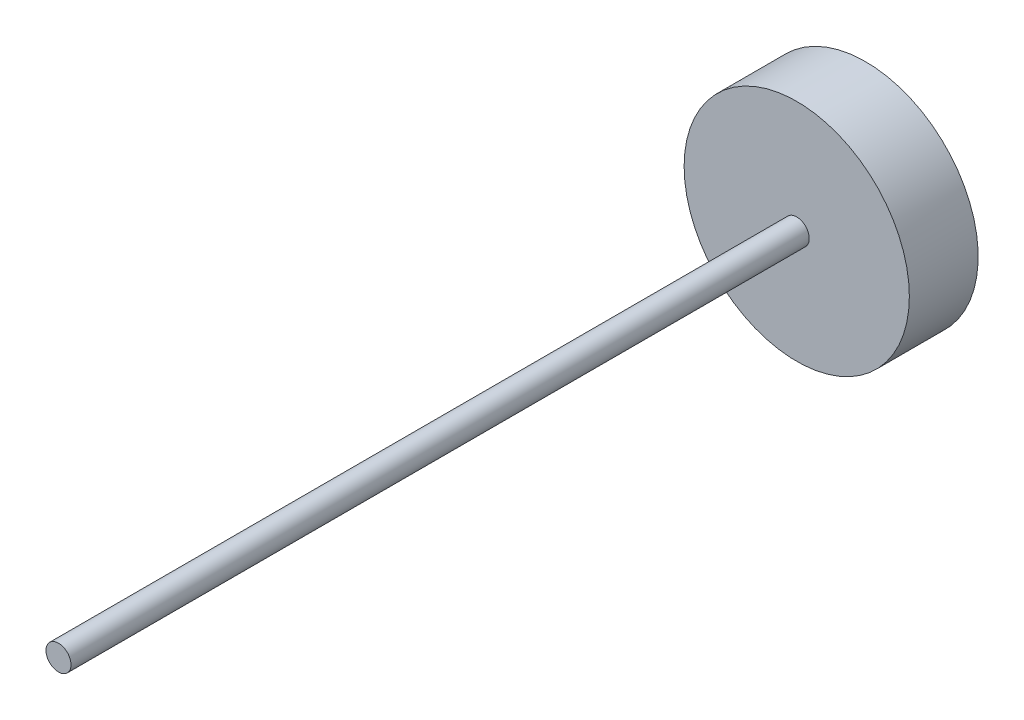
ISO-10303-21;
HEADER;
FILE_DESCRIPTION(('STEP AP214'),'2;1');
FILE_NAME('part.step','',(''),(''),'','','');
FILE_SCHEMA(('AUTOMOTIVE_DESIGN { 1 0 10303 214 1 1 1 1 }'));
ENDSEC;
DATA;
#1=APPLICATION_CONTEXT('core data for automotive mechanical design processes');
#2=APPLICATION_PROTOCOL_DEFINITION('international standard','automotive_design',2000,#1);
#3=PRODUCT_CONTEXT('',#1,'mechanical');
#4=PRODUCT('Part','Part','',(#3));
#5=PRODUCT_RELATED_PRODUCT_CATEGORY('part','',(#4));
#6=PRODUCT_DEFINITION_FORMATION('','',#4);
#7=PRODUCT_DEFINITION_CONTEXT('part definition',#1,'design');
#8=PRODUCT_DEFINITION('design','',#6,#7);
#9=PRODUCT_DEFINITION_SHAPE('','',#8);
#10=(LENGTH_UNIT() NAMED_UNIT(*) SI_UNIT(.MILLI.,.METRE.));
#11=(NAMED_UNIT(*) PLANE_ANGLE_UNIT() SI_UNIT($,.RADIAN.));
#12=(NAMED_UNIT(*) SI_UNIT($,.STERADIAN.) SOLID_ANGLE_UNIT());
#13=UNCERTAINTY_MEASURE_WITH_UNIT(LENGTH_MEASURE(1.E-05),#10,'distance_accuracy_value','');
#14=(GEOMETRIC_REPRESENTATION_CONTEXT(3) GLOBAL_UNCERTAINTY_ASSIGNED_CONTEXT((#13)) GLOBAL_UNIT_ASSIGNED_CONTEXT((#10,
#11,#12)) REPRESENTATION_CONTEXT('',''));
#15=CARTESIAN_POINT('',(0.,0.,0.));
#16=DIRECTION('',(0.,0.,1.));
#17=DIRECTION('',(1.,0.,0.));
#18=AXIS2_PLACEMENT_3D('',#15,#16,#17);
#19=CARTESIAN_POINT('',(0.,0.,78.6304849884528));
#20=DIRECTION('',(0.,0.,1.));
#21=DIRECTION('',(1.,0.,0.));
#22=AXIS2_PLACEMENT_3D('',#19,#20,#21);
#23=PLANE('',#22);
#24=CARTESIAN_POINT('',(0.,0.,78.6304849884528));
#25=DIRECTION('',(0.,0.,1.));
#26=DIRECTION('',(1.,0.,0.));
#27=AXIS2_PLACEMENT_3D('',#24,#25,#26);
#28=CIRCLE('',#27,2.);
#29=CARTESIAN_POINT('',(2.00000000000002,0.,78.6304849884528));
#30=VERTEX_POINT('',#29);
#31=EDGE_CURVE('E10',#30,#30,#28,.T.);
#32=ORIENTED_EDGE('',*,*,#31,.F.);
#33=EDGE_LOOP('',(#32));
#34=FACE_BOUND('',#33,.T.);
#35=CARTESIAN_POINT('',(0.,0.,78.6304849884528));
#36=DIRECTION('',(0.,0.,1.));
#37=DIRECTION('',(1.,0.,0.));
#38=AXIS2_PLACEMENT_3D('',#35,#36,#37);
#39=CIRCLE('',#38,18.);
#40=CARTESIAN_POINT('',(18.,0.,78.6304849884528));
#41=VERTEX_POINT('',#40);
#42=EDGE_CURVE('E57',#41,#41,#39,.T.);
#43=ORIENTED_EDGE('',*,*,#42,.T.);
#44=EDGE_LOOP('',(#43));
#45=FACE_BOUND('',#44,.T.);
#46=ADVANCED_FACE('F43',(#34,#45),#23,.T.);
#47=CARTESIAN_POINT('',(0.,0.,90.6304849884528));
#48=DIRECTION('',(0.,0.,-1.));
#49=DIRECTION('',(-1.,0.,0.));
#50=AXIS2_PLACEMENT_3D('',#47,#48,#49);
#51=CYLINDRICAL_SURFACE('',#50,2.);
#52=ORIENTED_EDGE('',*,*,#31,.T.);
#53=EDGE_LOOP('',(#52));
#54=FACE_BOUND('',#53,.T.);
#55=CARTESIAN_POINT('',(0.,0.,196.630484988453));
#56=DIRECTION('',(0.,0.,1.));
#57=DIRECTION('',(1.,0.,0.));
#58=AXIS2_PLACEMENT_3D('',#55,#56,#57);
#59=CIRCLE('',#58,2.);
#60=CARTESIAN_POINT('',(2.00000000000002,0.,196.630484988453));
#61=VERTEX_POINT('',#60);
#62=EDGE_CURVE('E50',#61,#61,#59,.T.);
#63=ORIENTED_EDGE('',*,*,#62,.F.);
#64=EDGE_LOOP('',(#63));
#65=FACE_BOUND('',#64,.T.);
#66=ADVANCED_FACE('F94',(#54,#65),#51,.T.);
#67=CARTESIAN_POINT('',(0.,0.,196.630484988453));
#68=DIRECTION('',(0.,0.,1.));
#69=DIRECTION('',(1.,0.,0.));
#70=AXIS2_PLACEMENT_3D('',#67,#68,#69);
#71=PLANE('',#70);
#72=ORIENTED_EDGE('',*,*,#62,.T.);
#73=EDGE_LOOP('',(#72));
#74=FACE_BOUND('',#73,.T.);
#75=ADVANCED_FACE('F99',(#74),#71,.T.);
#76=CARTESIAN_POINT('',(0.,0.,87.6304849884528));
#77=DIRECTION('',(0.,0.,-1.));
#78=DIRECTION('',(-1.,0.,0.));
#79=AXIS2_PLACEMENT_3D('',#76,#77,#78);
#80=CYLINDRICAL_SURFACE('',#79,18.);
#81=ORIENTED_EDGE('',*,*,#42,.F.);
#82=EDGE_LOOP('',(#81));
#83=FACE_BOUND('',#82,.T.);
#84=CARTESIAN_POINT('',(0.,0.,67.6304849884528));
#85=DIRECTION('',(0.,0.,-1.));
#86=DIRECTION('',(-1.,0.,0.));
#87=AXIS2_PLACEMENT_3D('',#84,#85,#86);
#88=CIRCLE('',#87,18.);
#89=CARTESIAN_POINT('',(-18.,0.,67.6304849884528));
#90=VERTEX_POINT('',#89);
#91=EDGE_CURVE('E63',#90,#90,#88,.T.);
#92=ORIENTED_EDGE('',*,*,#91,.F.);
#93=EDGE_LOOP('',(#92));
#94=FACE_BOUND('',#93,.T.);
#95=ADVANCED_FACE('F90',(#83,#94),#80,.T.);
#96=CARTESIAN_POINT('',(0.,0.,67.6304849884528));
#97=DIRECTION('',(0.,0.,-1.));
#98=DIRECTION('',(-1.,0.,0.));
#99=AXIS2_PLACEMENT_3D('',#96,#97,#98);
#100=PLANE('',#99);
#101=CARTESIAN_POINT('',(0.,0.,67.6304849884528));
#102=DIRECTION('',(0.,0.,-1.));
#103=DIRECTION('',(-1.,0.,0.));
#104=AXIS2_PLACEMENT_3D('',#101,#102,#103);
#105=CIRCLE('',#104,16.);
#106=CARTESIAN_POINT('',(-16.,0.,67.6304849884528));
#107=VERTEX_POINT('',#106);
#108=EDGE_CURVE('E70',#107,#107,#105,.T.);
#109=ORIENTED_EDGE('',*,*,#108,.F.);
#110=EDGE_LOOP('',(#109));
#111=FACE_BOUND('',#110,.T.);
#112=ORIENTED_EDGE('',*,*,#91,.T.);
#113=EDGE_LOOP('',(#112));
#114=FACE_BOUND('',#113,.T.);
#115=ADVANCED_FACE('F83',(#111,#114),#100,.T.);
#116=CARTESIAN_POINT('',(0.,0.,76.6304849884528));
#117=DIRECTION('',(0.,0.,1.));
#118=DIRECTION('',(1.,0.,0.));
#119=AXIS2_PLACEMENT_3D('',#116,#117,#118);
#120=PLANE('',#119);
#121=CARTESIAN_POINT('',(0.,0.,76.6304849884528));
#122=DIRECTION('',(0.,0.,1.));
#123=DIRECTION('',(1.,0.,0.));
#124=AXIS2_PLACEMENT_3D('',#121,#122,#123);
#125=CIRCLE('',#124,16.);
#126=CARTESIAN_POINT('',(16.,0.,76.6304849884528));
#127=VERTEX_POINT('',#126);
#128=EDGE_CURVE('E69',#127,#127,#125,.T.);
#129=ORIENTED_EDGE('',*,*,#128,.F.);
#130=EDGE_LOOP('',(#129));
#131=FACE_BOUND('',#130,.T.);
#132=ADVANCED_FACE('F81',(#131),#120,.F.);
#133=CARTESIAN_POINT('',(0.,0.,87.6304849884528));
#134=DIRECTION('',(0.,0.,-1.));
#135=DIRECTION('',(-1.,0.,0.));
#136=AXIS2_PLACEMENT_3D('',#133,#134,#135);
#137=CYLINDRICAL_SURFACE('',#136,16.);
#138=ORIENTED_EDGE('',*,*,#128,.T.);
#139=EDGE_LOOP('',(#138));
#140=FACE_BOUND('',#139,.T.);
#141=ORIENTED_EDGE('',*,*,#108,.T.);
#142=EDGE_LOOP('',(#141));
#143=FACE_BOUND('',#142,.T.);
#144=ADVANCED_FACE('F78',(#140,#143),#137,.F.);
#145=CLOSED_SHELL('',(#46,#66,#75,#95,#115,#132,#144));
#146=MANIFOLD_SOLID_BREP('B2',#145);
#147=ADVANCED_BREP_SHAPE_REPRESENTATION('',(#18,#146),#14);
#148=SHAPE_DEFINITION_REPRESENTATION(#9,#147);
ENDSEC;
END-ISO-10303-21;
